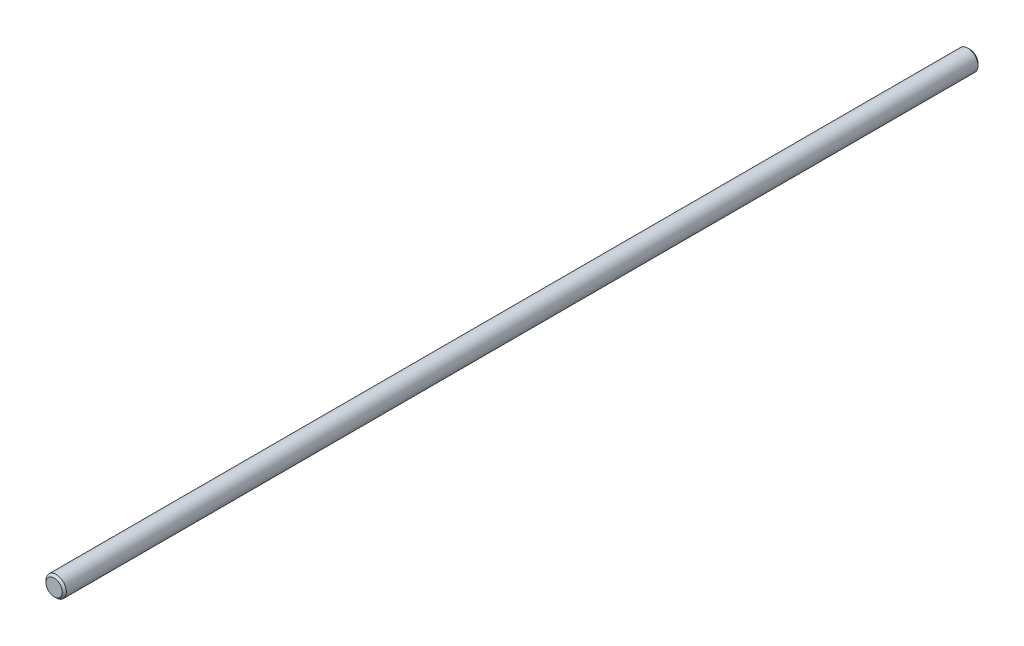
ISO-10303-21;
HEADER;
FILE_DESCRIPTION(('STEP AP214'),'2;1');
FILE_NAME('part.step','',(''),(''),'','','');
FILE_SCHEMA(('AUTOMOTIVE_DESIGN { 1 0 10303 214 1 1 1 1 }'));
ENDSEC;
DATA;
#1=APPLICATION_CONTEXT('core data for automotive mechanical design processes');
#2=APPLICATION_PROTOCOL_DEFINITION('international standard','automotive_design',2000,#1);
#3=PRODUCT_CONTEXT('',#1,'mechanical');
#4=PRODUCT('Part','Part','',(#3));
#5=PRODUCT_RELATED_PRODUCT_CATEGORY('part','',(#4));
#6=PRODUCT_DEFINITION_FORMATION('','',#4);
#7=PRODUCT_DEFINITION_CONTEXT('part definition',#1,'design');
#8=PRODUCT_DEFINITION('design','',#6,#7);
#9=PRODUCT_DEFINITION_SHAPE('','',#8);
#10=(LENGTH_UNIT() NAMED_UNIT(*) SI_UNIT(.MILLI.,.METRE.));
#11=(NAMED_UNIT(*) PLANE_ANGLE_UNIT() SI_UNIT($,.RADIAN.));
#12=(NAMED_UNIT(*) SI_UNIT($,.STERADIAN.) SOLID_ANGLE_UNIT());
#13=UNCERTAINTY_MEASURE_WITH_UNIT(LENGTH_MEASURE(1.E-05),#10,'distance_accuracy_value','');
#14=(GEOMETRIC_REPRESENTATION_CONTEXT(3) GLOBAL_UNCERTAINTY_ASSIGNED_CONTEXT((#13)) GLOBAL_UNIT_ASSIGNED_CONTEXT((#10,
#11,#12)) REPRESENTATION_CONTEXT('',''));
#15=CARTESIAN_POINT('',(0.,0.,0.));
#16=DIRECTION('',(0.,0.,1.));
#17=DIRECTION('',(1.,0.,0.));
#18=AXIS2_PLACEMENT_3D('',#15,#16,#17);
#19=CARTESIAN_POINT('',(0.,0.,90.));
#20=DIRECTION('',(0.,0.,-1.));
#21=DIRECTION('',(-1.,0.,0.));
#22=AXIS2_PLACEMENT_3D('',#19,#20,#21);
#23=CYLINDRICAL_SURFACE('',#22,1.);
#24=CARTESIAN_POINT('',(0.,0.,89.8));
#25=DIRECTION('',(0.,0.,1.));
#26=DIRECTION('',(1.,0.,0.));
#27=AXIS2_PLACEMENT_3D('',#24,#25,#26);
#28=CIRCLE('',#27,1.);
#29=CARTESIAN_POINT('',(-1.,0.,89.8));
#30=VERTEX_POINT('',#29);
#31=EDGE_CURVE('E37',#30,#30,#28,.F.);
#32=CARTESIAN_POINT('',(0.,0.,0.200000000000117));
#33=DIRECTION('',(0.,0.,1.));
#34=DIRECTION('',(1.,0.,0.));
#35=AXIS2_PLACEMENT_3D('',#32,#33,#34);
#36=CIRCLE('',#35,1.);
#37=CARTESIAN_POINT('',(-1.,0.,0.200000000000103));
#38=VERTEX_POINT('',#37);
#39=EDGE_CURVE('E41',#38,#38,#36,.T.);
#40=CARTESIAN_POINT('',(-1.,0.,89.8));
#41=CARTESIAN_POINT('',(-1.,0.,88.8666666666667));
#42=CARTESIAN_POINT('',(-1.,0.,87.9333333333334));
#43=CARTESIAN_POINT('',(-1.,0.,86.0666666666667));
#44=CARTESIAN_POINT('',(-1.,0.,85.1333333333334));
#45=CARTESIAN_POINT('',(-1.,0.,83.2666666666667));
#46=CARTESIAN_POINT('',(-1.,0.,82.3333333333334));
#47=CARTESIAN_POINT('',(-1.,0.,80.4666666666667));
#48=CARTESIAN_POINT('',(-1.,0.,79.5333333333334));
#49=CARTESIAN_POINT('',(-1.,0.,77.6666666666667));
#50=CARTESIAN_POINT('',(-1.,0.,76.7333333333334));
#51=CARTESIAN_POINT('',(-1.,0.,74.8666666666667));
#52=CARTESIAN_POINT('',(-1.,0.,73.9333333333334));
#53=CARTESIAN_POINT('',(-1.,0.,72.0666666666667));
#54=CARTESIAN_POINT('',(-1.,0.,71.1333333333334));
#55=CARTESIAN_POINT('',(-1.,0.,69.2666666666667));
#56=CARTESIAN_POINT('',(-1.,0.,68.3333333333334));
#57=CARTESIAN_POINT('',(-1.,0.,66.4666666666667));
#58=CARTESIAN_POINT('',(-1.,0.,65.5333333333334));
#59=CARTESIAN_POINT('',(-1.,0.,63.6666666666667));
#60=CARTESIAN_POINT('',(-1.,0.,62.7333333333334));
#61=CARTESIAN_POINT('',(-1.,0.,60.8666666666667));
#62=CARTESIAN_POINT('',(-1.,0.,59.9333333333334));
#63=CARTESIAN_POINT('',(-1.,0.,58.0666666666667));
#64=CARTESIAN_POINT('',(-1.,0.,57.1333333333334));
#65=CARTESIAN_POINT('',(-1.,0.,55.2666666666667));
#66=CARTESIAN_POINT('',(-1.,0.,54.3333333333334));
#67=CARTESIAN_POINT('',(-1.,0.,52.4666666666667));
#68=CARTESIAN_POINT('',(-1.,0.,51.5333333333334));
#69=CARTESIAN_POINT('',(-1.,0.,49.6666666666667));
#70=CARTESIAN_POINT('',(-1.,0.,48.7333333333334));
#71=CARTESIAN_POINT('',(-1.,0.,46.8666666666667));
#72=CARTESIAN_POINT('',(-1.,0.,45.9333333333334));
#73=CARTESIAN_POINT('',(-1.,0.,44.0666666666667));
#74=CARTESIAN_POINT('',(-1.,0.,43.1333333333334));
#75=CARTESIAN_POINT('',(-1.,0.,41.2666666666667));
#76=CARTESIAN_POINT('',(-1.,0.,40.3333333333334));
#77=CARTESIAN_POINT('',(-1.,0.,38.4666666666667));
#78=CARTESIAN_POINT('',(-1.,0.,37.5333333333334));
#79=CARTESIAN_POINT('',(-1.,0.,35.6666666666667));
#80=CARTESIAN_POINT('',(-1.,0.,34.7333333333334));
#81=CARTESIAN_POINT('',(-1.,0.,32.8666666666667));
#82=CARTESIAN_POINT('',(-1.,0.,31.9333333333334));
#83=CARTESIAN_POINT('',(-1.,0.,30.0666666666667));
#84=CARTESIAN_POINT('',(-1.,0.,29.1333333333334));
#85=CARTESIAN_POINT('',(-1.,0.,27.2666666666668));
#86=CARTESIAN_POINT('',(-1.,0.,26.3333333333334));
#87=CARTESIAN_POINT('',(-1.,0.,24.4666666666668));
#88=CARTESIAN_POINT('',(-1.,0.,23.5333333333334));
#89=CARTESIAN_POINT('',(-1.,0.,21.6666666666667));
#90=CARTESIAN_POINT('',(-1.,0.,20.7333333333334));
#91=CARTESIAN_POINT('',(-1.,0.,18.8666666666667));
#92=CARTESIAN_POINT('',(-1.,0.,17.9333333333334));
#93=CARTESIAN_POINT('',(-1.,0.,16.0666666666668));
#94=CARTESIAN_POINT('',(-1.,0.,15.1333333333334));
#95=CARTESIAN_POINT('',(-1.,0.,13.2666666666668));
#96=CARTESIAN_POINT('',(-1.,0.,12.3333333333334));
#97=CARTESIAN_POINT('',(-1.,0.,10.4666666666668));
#98=CARTESIAN_POINT('',(-1.,0.,9.53333333333343));
#99=CARTESIAN_POINT('',(-1.,0.,7.66666666666676));
#100=CARTESIAN_POINT('',(-1.,0.,6.73333333333343));
#101=CARTESIAN_POINT('',(-1.,0.,4.86666666666676));
#102=CARTESIAN_POINT('',(-1.,0.,3.93333333333343));
#103=CARTESIAN_POINT('',(-1.,0.,2.06666666666677));
#104=CARTESIAN_POINT('',(-1.,0.,1.13333333333343));
#105=CARTESIAN_POINT('',(-1.,0.,0.200000000000103));
#106=B_SPLINE_CURVE_WITH_KNOTS('',3,(#40,#41,#42,#43,#44,#45,#46,#47,#48,#49,#50,#51,#52,#53,
#54,#55,#56,#57,#58,#59,#60,#61,#62,#63,#64,#65,#66,#67,#68,#69,#70,#71,#72,#73,#74,#75,#76,#77,
#78,#79,#80,#81,#82,#83,#84,#85,#86,#87,#88,#89,#90,#91,#92,#93,#94,#95,#96,#97,#98,#99,#100,
#101,#102,#103,#104,#105),.UNSPECIFIED.,.F.,.F.,(4,2,2,2,2,2,2,2,2,2,2,2,2,2,2,2,2,2,2,2,2,2,2,
2,2,2,2,2,2,2,2,2,4),(0.,2.80000000000001,5.60000000000001,8.4,11.2,14.,16.8,19.6,22.4,25.2,28.,
30.8,33.6,36.4,39.2,42.,44.8,47.6,50.4,53.2,56.,58.8,61.6,64.3999999999999,67.2,70.,72.8,75.6,
78.3999999999999,81.1999999999999,83.9999999999999,86.7999999999999,89.5999999999999),.UNSPECIFIED.);
#107=EDGE_CURVE('BSEAM30',#30,#38,#106,.T.);
#108=ORIENTED_EDGE('',*,*,#31,.T.);
#109=ORIENTED_EDGE('',*,*,#39,.T.);
#110=ORIENTED_EDGE('',*,*,#107,.T.);
#111=ORIENTED_EDGE('',*,*,#107,.F.);
#112=EDGE_LOOP('',(#108,#110,#109,#111));
#113=FACE_BOUND('',#112,.T.);
#114=ADVANCED_FACE('F30',(#113),#23,.T.);
#115=CARTESIAN_POINT('',(0.,0.,90.));
#116=DIRECTION('',(0.,0.,1.));
#117=DIRECTION('',(1.,0.,0.));
#118=AXIS2_PLACEMENT_3D('',#115,#116,#117);
#119=PLANE('',#118);
#120=CARTESIAN_POINT('',(0.,0.,90.));
#121=DIRECTION('',(0.,0.,1.));
#122=DIRECTION('',(1.,0.,0.));
#123=AXIS2_PLACEMENT_3D('',#120,#121,#122);
#124=CIRCLE('',#123,0.800000000000023);
#125=CARTESIAN_POINT('',(0.800000000000023,0.,90.));
#126=VERTEX_POINT('',#125);
#127=EDGE_CURVE('E45',#126,#126,#124,.T.);
#128=ORIENTED_EDGE('',*,*,#127,.T.);
#129=EDGE_LOOP('',(#128));
#130=FACE_BOUND('',#129,.T.);
#131=ADVANCED_FACE('F51',(#130),#119,.T.);
#132=CARTESIAN_POINT('',(0.,0.,0.));
#133=DIRECTION('',(0.,0.,1.));
#134=DIRECTION('',(1.,0.,0.));
#135=AXIS2_PLACEMENT_3D('',#132,#133,#134);
#136=PLANE('',#135);
#137=CARTESIAN_POINT('',(0.,0.,0.));
#138=DIRECTION('',(0.,0.,1.));
#139=DIRECTION('',(1.,0.,0.));
#140=AXIS2_PLACEMENT_3D('',#137,#138,#139);
#141=CIRCLE('',#140,0.799999999999898);
#142=CARTESIAN_POINT('',(0.799999999999898,0.,0.));
#143=VERTEX_POINT('',#142);
#144=EDGE_CURVE('E10',#143,#143,#141,.F.);
#145=ORIENTED_EDGE('',*,*,#144,.T.);
#146=EDGE_LOOP('',(#145));
#147=FACE_BOUND('',#146,.T.);
#148=ADVANCED_FACE('F55',(#147),#136,.F.);
#149=CARTESIAN_POINT('',(0.,0.,90.));
#150=DIRECTION('',(0.,0.,-1.));
#151=DIRECTION('',(-1.,0.,0.));
#152=AXIS2_PLACEMENT_3D('',#149,#150,#151);
#153=CONICAL_SURFACE('',#152,0.800000000000023,0.785398163397481);
#154=ORIENTED_EDGE('',*,*,#31,.F.);
#155=EDGE_LOOP('',(#154));
#156=FACE_BOUND('',#155,.T.);
#157=ORIENTED_EDGE('',*,*,#127,.F.);
#158=EDGE_LOOP('',(#157));
#159=FACE_BOUND('',#158,.T.);
#160=ADVANCED_FACE('F53',(#156,#159),#153,.T.);
#161=CARTESIAN_POINT('',(0.,0.,0.200000000000117));
#162=DIRECTION('',(0.,0.,1.));
#163=DIRECTION('',(1.,0.,0.));
#164=AXIS2_PLACEMENT_3D('',#161,#162,#163);
#165=CONICAL_SURFACE('',#164,1.,0.785398163397412);
#166=ORIENTED_EDGE('',*,*,#144,.F.);
#167=EDGE_LOOP('',(#166));
#168=FACE_BOUND('',#167,.T.);
#169=ORIENTED_EDGE('',*,*,#39,.F.);
#170=EDGE_LOOP('',(#169));
#171=FACE_BOUND('',#170,.T.);
#172=ADVANCED_FACE('F32',(#168,#171),#165,.T.);
#173=CLOSED_SHELL('',(#114,#131,#148,#160,#172));
#174=MANIFOLD_SOLID_BREP('B2',#173);
#175=ADVANCED_BREP_SHAPE_REPRESENTATION('',(#18,#174),#14);
#176=SHAPE_DEFINITION_REPRESENTATION(#9,#175);
ENDSEC;
END-ISO-10303-21;
